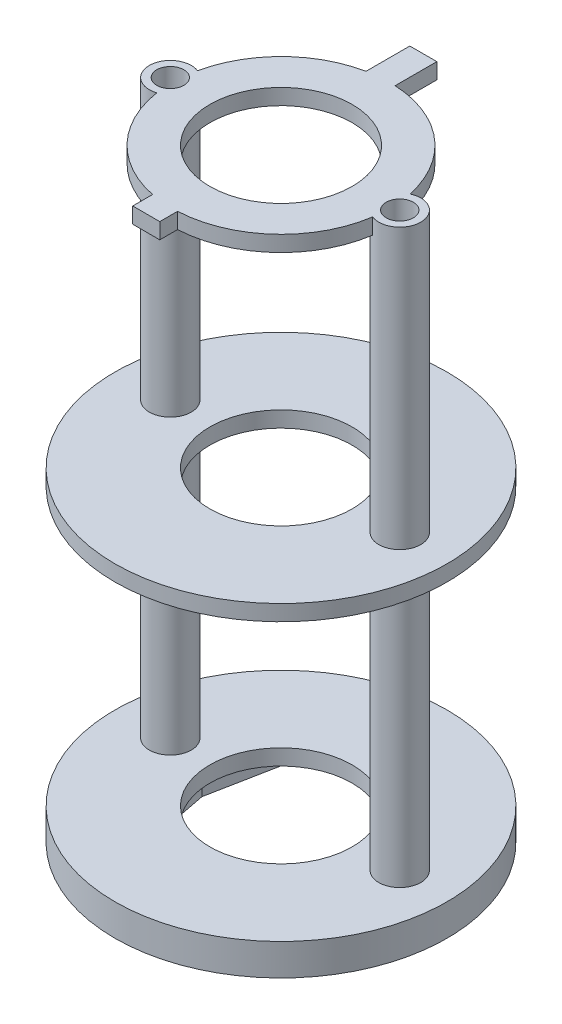
ISO-10303-21;
HEADER;
FILE_DESCRIPTION(('STEP AP214'),'2;1');
FILE_NAME('part.step','',(''),(''),'','','');
FILE_SCHEMA(('AUTOMOTIVE_DESIGN { 1 0 10303 214 1 1 1 1 }'));
ENDSEC;
DATA;
#1=APPLICATION_CONTEXT('core data for automotive mechanical design processes');
#2=APPLICATION_PROTOCOL_DEFINITION('international standard','automotive_design',2000,#1);
#3=PRODUCT_CONTEXT('',#1,'mechanical');
#4=PRODUCT('Part','Part','',(#3));
#5=PRODUCT_RELATED_PRODUCT_CATEGORY('part','',(#4));
#6=PRODUCT_DEFINITION_FORMATION('','',#4);
#7=PRODUCT_DEFINITION_CONTEXT('part definition',#1,'design');
#8=PRODUCT_DEFINITION('design','',#6,#7);
#9=PRODUCT_DEFINITION_SHAPE('','',#8);
#10=(LENGTH_UNIT() NAMED_UNIT(*) SI_UNIT(.MILLI.,.METRE.));
#11=(NAMED_UNIT(*) PLANE_ANGLE_UNIT() SI_UNIT($,.RADIAN.));
#12=(NAMED_UNIT(*) SI_UNIT($,.STERADIAN.) SOLID_ANGLE_UNIT());
#13=UNCERTAINTY_MEASURE_WITH_UNIT(LENGTH_MEASURE(1.E-05),#10,'distance_accuracy_value','');
#14=(GEOMETRIC_REPRESENTATION_CONTEXT(3) GLOBAL_UNCERTAINTY_ASSIGNED_CONTEXT((#13)) GLOBAL_UNIT_ASSIGNED_CONTEXT((#10,
#11,#12)) REPRESENTATION_CONTEXT('',''));
#15=CARTESIAN_POINT('',(0.,0.,0.));
#16=DIRECTION('',(0.,0.,1.));
#17=DIRECTION('',(1.,0.,0.));
#18=AXIS2_PLACEMENT_3D('',#15,#16,#17);
#19=CARTESIAN_POINT('',(14.5796,-2.,-0.434340000000001));
#20=DIRECTION('',(0.,1.,0.));
#21=DIRECTION('',(0.,0.,1.));
#22=AXIS2_PLACEMENT_3D('',#19,#20,#21);
#23=CYLINDRICAL_SURFACE('',#22,2.6543);
#24=CARTESIAN_POINT('',(14.5796,-72.305,-0.434340000000001));
#25=DIRECTION('',(0.,-1.,0.));
#26=DIRECTION('',(0.,0.,-1.));
#27=AXIS2_PLACEMENT_3D('',#24,#25,#26);
#28=CIRCLE('',#27,2.6543);
#29=CARTESIAN_POINT('',(14.5796,-72.305,-3.08864));
#30=VERTEX_POINT('',#29);
#31=EDGE_CURVE('E286',#30,#30,#28,.F.);
#32=ORIENTED_EDGE('',*,*,#31,.T.);
#33=EDGE_LOOP('',(#32));
#34=FACE_BOUND('',#33,.T.);
#35=CARTESIAN_POINT('',(14.5796,-37.305,-0.434340000000001));
#36=DIRECTION('',(0.,1.,0.));
#37=DIRECTION('',(0.,0.,1.));
#38=AXIS2_PLACEMENT_3D('',#35,#36,#37);
#39=CIRCLE('',#38,2.6543);
#40=CARTESIAN_POINT('',(14.5796,-37.305,2.21996));
#41=VERTEX_POINT('',#40);
#42=EDGE_CURVE('E221',#41,#41,#39,.F.);
#43=ORIENTED_EDGE('',*,*,#42,.T.);
#44=EDGE_LOOP('',(#43));
#45=FACE_BOUND('',#44,.T.);
#46=ADVANCED_FACE('F33',(#34,#45),#23,.T.);
#47=CARTESIAN_POINT('',(-14.4272,-2.,-0.434340000000001));
#48=DIRECTION('',(0.,1.,0.));
#49=DIRECTION('',(0.,0.,1.));
#50=AXIS2_PLACEMENT_3D('',#47,#48,#49);
#51=CYLINDRICAL_SURFACE('',#50,2.6543);
#52=CARTESIAN_POINT('',(-14.4272,-72.305,-0.434340000000001));
#53=DIRECTION('',(0.,-1.,0.));
#54=DIRECTION('',(0.,0.,-1.));
#55=AXIS2_PLACEMENT_3D('',#52,#53,#54);
#56=CIRCLE('',#55,2.6543);
#57=CARTESIAN_POINT('',(-14.4272,-72.305,-3.08864));
#58=VERTEX_POINT('',#57);
#59=EDGE_CURVE('E283',#58,#58,#56,.F.);
#60=ORIENTED_EDGE('',*,*,#59,.T.);
#61=EDGE_LOOP('',(#60));
#62=FACE_BOUND('',#61,.T.);
#63=CARTESIAN_POINT('',(-14.4272,-37.305,-0.434340000000001));
#64=DIRECTION('',(0.,1.,0.));
#65=DIRECTION('',(0.,0.,1.));
#66=AXIS2_PLACEMENT_3D('',#63,#64,#65);
#67=CIRCLE('',#66,2.6543);
#68=CARTESIAN_POINT('',(-14.4272,-37.305,2.21996));
#69=VERTEX_POINT('',#68);
#70=EDGE_CURVE('E634',#69,#69,#67,.F.);
#71=ORIENTED_EDGE('',*,*,#70,.T.);
#72=EDGE_LOOP('',(#71));
#73=FACE_BOUND('',#72,.T.);
#74=ADVANCED_FACE('F397',(#62,#73),#51,.T.);
#75=CARTESIAN_POINT('',(0.,-72.305,0.));
#76=DIRECTION('',(0.,-1.,0.));
#77=DIRECTION('',(0.,0.,-1.));
#78=AXIS2_PLACEMENT_3D('',#75,#76,#77);
#79=CYLINDRICAL_SURFACE('',#78,8.99);
#80=CARTESIAN_POINT('',(0.,-72.305,0.));
#81=DIRECTION('',(0.,-1.,0.));
#82=DIRECTION('',(0.,0.,-1.));
#83=AXIS2_PLACEMENT_3D('',#80,#81,#82);
#84=CIRCLE('',#83,8.99);
#85=CARTESIAN_POINT('',(0.,-72.305,-8.99));
#86=VERTEX_POINT('',#85);
#87=EDGE_CURVE('E277',#86,#86,#84,.T.);
#88=ORIENTED_EDGE('',*,*,#87,.F.);
#89=EDGE_LOOP('',(#88));
#90=FACE_BOUND('',#89,.T.);
#91=CARTESIAN_POINT('',(0.,-74.305,0.));
#92=DIRECTION('',(0.,-1.,0.));
#93=DIRECTION('',(0.,0.,-1.));
#94=AXIS2_PLACEMENT_3D('',#91,#92,#93);
#95=CIRCLE('',#94,8.99);
#96=CARTESIAN_POINT('',(0.,-74.305,-8.99));
#97=VERTEX_POINT('',#96);
#98=EDGE_CURVE('E37',#97,#97,#95,.F.);
#99=ORIENTED_EDGE('',*,*,#98,.F.);
#100=EDGE_LOOP('',(#99));
#101=FACE_BOUND('',#100,.T.);
#102=ADVANCED_FACE('F404',(#90,#101),#79,.F.);
#103=CARTESIAN_POINT('',(0.,-72.305,0.));
#104=DIRECTION('',(0.,-1.,0.));
#105=DIRECTION('',(0.,0.,-1.));
#106=AXIS2_PLACEMENT_3D('',#103,#104,#105);
#107=CYLINDRICAL_SURFACE('',#106,21.);
#108=CARTESIAN_POINT('',(0.,-72.305,0.));
#109=DIRECTION('',(0.,-1.,0.));
#110=DIRECTION('',(0.,0.,-1.));
#111=AXIS2_PLACEMENT_3D('',#108,#109,#110);
#112=CIRCLE('',#111,21.);
#113=CARTESIAN_POINT('',(0.,-72.305,-21.));
#114=VERTEX_POINT('',#113);
#115=EDGE_CURVE('E280',#114,#114,#112,.T.);
#116=ORIENTED_EDGE('',*,*,#115,.T.);
#117=EDGE_LOOP('',(#116));
#118=FACE_BOUND('',#117,.T.);
#119=CARTESIAN_POINT('',(0.,-76.305,0.));
#120=DIRECTION('',(0.,-1.,0.));
#121=DIRECTION('',(0.,0.,-1.));
#122=AXIS2_PLACEMENT_3D('',#119,#120,#121);
#123=CIRCLE('',#122,21.);
#124=CARTESIAN_POINT('',(0.,-76.305,-21.));
#125=VERTEX_POINT('',#124);
#126=EDGE_CURVE('E274',#125,#125,#123,.T.);
#127=ORIENTED_EDGE('',*,*,#126,.F.);
#128=EDGE_LOOP('',(#127));
#129=FACE_BOUND('',#128,.T.);
#130=ADVANCED_FACE('F463',(#118,#129),#107,.T.);
#131=CARTESIAN_POINT('',(0.,-72.305,0.));
#132=DIRECTION('',(0.,-1.,0.));
#133=DIRECTION('',(0.,0.,-1.));
#134=AXIS2_PLACEMENT_3D('',#131,#132,#133);
#135=PLANE('',#134);
#136=ORIENTED_EDGE('',*,*,#31,.F.);
#137=EDGE_LOOP('',(#136));
#138=FACE_BOUND('',#137,.T.);
#139=ORIENTED_EDGE('',*,*,#59,.F.);
#140=EDGE_LOOP('',(#139));
#141=FACE_BOUND('',#140,.T.);
#142=ORIENTED_EDGE('',*,*,#87,.T.);
#143=EDGE_LOOP('',(#142));
#144=FACE_BOUND('',#143,.T.);
#145=ORIENTED_EDGE('',*,*,#115,.F.);
#146=EDGE_LOOP('',(#145));
#147=FACE_BOUND('',#146,.T.);
#148=ADVANCED_FACE('F466',(#138,#141,#144,#147),#135,.F.);
#149=CARTESIAN_POINT('',(0.,-76.305,0.));
#150=DIRECTION('',(0.,-1.,0.));
#151=DIRECTION('',(0.,0.,-1.));
#152=AXIS2_PLACEMENT_3D('',#149,#150,#151);
#153=PLANE('',#152);
#154=DIRECTION('',(-0.190580912141045,0.,-0.981671490839724));
#155=VECTOR('',#154,1.);
#156=CARTESIAN_POINT('',(-7.35,-76.305,13.65));
#157=LINE('',#156,#155);
#158=CARTESIAN_POINT('',(-7.35,-76.305,13.65));
#159=VERTEX_POINT('',#158);
#160=CARTESIAN_POINT('',(-10.,-76.305,0.));
#161=VERTEX_POINT('',#160);
#162=EDGE_CURVE('E50',#159,#161,#157,.T.);
#163=ORIENTED_EDGE('',*,*,#162,.F.);
#164=CARTESIAN_POINT('',(0.,-76.305,0.00348029716001202));
#165=DIRECTION('',(0.,1.,0.));
#166=DIRECTION('',(0.,0.,1.));
#167=AXIS2_PLACEMENT_3D('',#164,#165,#166);
#168=CIRCLE('',#167,15.5);
#169=CARTESIAN_POINT('',(7.35,-76.305,13.65));
#170=VERTEX_POINT('',#169);
#171=EDGE_CURVE('E228',#159,#170,#168,.T.);
#172=ORIENTED_EDGE('',*,*,#171,.T.);
#173=DIRECTION('',(-0.190580912141045,0.,0.981671490839724));
#174=VECTOR('',#173,1.);
#175=CARTESIAN_POINT('',(10.,-76.305,0.));
#176=LINE('',#175,#174);
#177=CARTESIAN_POINT('',(10.,-76.305,0.));
#178=VERTEX_POINT('',#177);
#179=EDGE_CURVE('E254',#178,#170,#176,.T.);
#180=ORIENTED_EDGE('',*,*,#179,.F.);
#181=DIRECTION('',(0.190580912141045,0.,0.981671490839724));
#182=VECTOR('',#181,1.);
#183=CARTESIAN_POINT('',(7.35,-76.305,-13.65));
#184=LINE('',#183,#182);
#185=CARTESIAN_POINT('',(7.35,-76.305,-13.65));
#186=VERTEX_POINT('',#185);
#187=EDGE_CURVE('E251',#186,#178,#184,.T.);
#188=ORIENTED_EDGE('',*,*,#187,.F.);
#189=CARTESIAN_POINT('',(0.,-76.305,-0.00348029716001029));
#190=DIRECTION('',(0.,-1.,0.));
#191=DIRECTION('',(0.,0.,-1.));
#192=AXIS2_PLACEMENT_3D('',#189,#190,#191);
#193=CIRCLE('',#192,15.5);
#194=CARTESIAN_POINT('',(-7.35,-76.305,-13.65));
#195=VERTEX_POINT('',#194);
#196=EDGE_CURVE('E248',#195,#186,#193,.T.);
#197=ORIENTED_EDGE('',*,*,#196,.F.);
#198=DIRECTION('',(0.190580912141045,0.,-0.981671490839724));
#199=VECTOR('',#198,1.);
#200=CARTESIAN_POINT('',(-10.,-76.305,0.));
#201=LINE('',#200,#199);
#202=EDGE_CURVE('E245',#161,#195,#201,.T.);
#203=ORIENTED_EDGE('',*,*,#202,.F.);
#204=EDGE_LOOP('',(#163,#172,#180,#188,#197,#203));
#205=FACE_BOUND('',#204,.T.);
#206=ORIENTED_EDGE('',*,*,#126,.T.);
#207=EDGE_LOOP('',(#206));
#208=FACE_BOUND('',#207,.T.);
#209=ADVANCED_FACE('F380',(#205,#208),#153,.T.);
#210=CARTESIAN_POINT('',(0.,-74.305,-0.00348029716001029));
#211=DIRECTION('',(0.,-1.,0.));
#212=DIRECTION('',(0.,0.,-1.));
#213=AXIS2_PLACEMENT_3D('',#210,#211,#212);
#214=PLANE('',#213);
#215=DIRECTION('',(-0.190580912141045,0.,-0.981671490839724));
#216=VECTOR('',#215,1.);
#217=CARTESIAN_POINT('',(-7.35,-74.305,13.65));
#218=LINE('',#217,#216);
#219=CARTESIAN_POINT('',(-7.35,-74.305,13.65));
#220=VERTEX_POINT('',#219);
#221=CARTESIAN_POINT('',(-10.,-74.305,0.));
#222=VERTEX_POINT('',#221);
#223=EDGE_CURVE('E224',#220,#222,#218,.T.);
#224=ORIENTED_EDGE('',*,*,#223,.T.);
#225=DIRECTION('',(0.190580912141045,0.,-0.981671490839724));
#226=VECTOR('',#225,1.);
#227=CARTESIAN_POINT('',(-10.,-74.305,0.));
#228=LINE('',#227,#226);
#229=CARTESIAN_POINT('',(-7.35,-74.305,-13.65));
#230=VERTEX_POINT('',#229);
#231=EDGE_CURVE('E227',#222,#230,#228,.T.);
#232=ORIENTED_EDGE('',*,*,#231,.T.);
#233=CARTESIAN_POINT('',(0.,-74.305,-0.00348029716001029));
#234=DIRECTION('',(0.,-1.,0.));
#235=DIRECTION('',(0.,0.,-1.));
#236=AXIS2_PLACEMENT_3D('',#233,#234,#235);
#237=CIRCLE('',#236,15.5);
#238=CARTESIAN_POINT('',(7.35,-74.305,-13.65));
#239=VERTEX_POINT('',#238);
#240=EDGE_CURVE('E231',#230,#239,#237,.T.);
#241=ORIENTED_EDGE('',*,*,#240,.T.);
#242=DIRECTION('',(0.190580912141045,0.,0.981671490839724));
#243=VECTOR('',#242,1.);
#244=CARTESIAN_POINT('',(7.35,-74.305,-13.65));
#245=LINE('',#244,#243);
#246=CARTESIAN_POINT('',(10.,-74.305,0.));
#247=VERTEX_POINT('',#246);
#248=EDGE_CURVE('E234',#239,#247,#245,.T.);
#249=ORIENTED_EDGE('',*,*,#248,.T.);
#250=DIRECTION('',(-0.190580912141045,0.,0.981671490839724));
#251=VECTOR('',#250,1.);
#252=CARTESIAN_POINT('',(10.,-74.305,0.));
#253=LINE('',#252,#251);
#254=CARTESIAN_POINT('',(7.35,-74.305,13.65));
#255=VERTEX_POINT('',#254);
#256=EDGE_CURVE('E237',#247,#255,#253,.T.);
#257=ORIENTED_EDGE('',*,*,#256,.T.);
#258=CARTESIAN_POINT('',(0.,-74.305,0.00348029716001202));
#259=DIRECTION('',(0.,1.,0.));
#260=DIRECTION('',(0.,0.,1.));
#261=AXIS2_PLACEMENT_3D('',#258,#259,#260);
#262=CIRCLE('',#261,15.5);
#263=EDGE_CURVE('E240',#220,#255,#262,.T.);
#264=ORIENTED_EDGE('',*,*,#263,.F.);
#265=EDGE_LOOP('',(#224,#232,#241,#249,#257,#264));
#266=FACE_BOUND('',#265,.T.);
#267=ORIENTED_EDGE('',*,*,#98,.T.);
#268=EDGE_LOOP('',(#267));
#269=FACE_BOUND('',#268,.T.);
#270=ADVANCED_FACE('F368',(#266,#269),#214,.T.);
#271=CARTESIAN_POINT('',(-7.35,-74.305,13.65));
#272=DIRECTION('',(-0.981671490839724,0.,0.190580912141046));
#273=DIRECTION('',(0.190580912141046,0.,0.981671490839724));
#274=AXIS2_PLACEMENT_3D('',#271,#272,#273);
#275=PLANE('',#274);
#276=ORIENTED_EDGE('',*,*,#162,.T.);
#277=DIRECTION('',(0.,-1.,0.));
#278=VECTOR('',#277,1.);
#279=CARTESIAN_POINT('',(-10.,-74.305,0.));
#280=LINE('',#279,#278);
#281=EDGE_CURVE('E243',#222,#161,#280,.T.);
#282=ORIENTED_EDGE('',*,*,#281,.F.);
#283=ORIENTED_EDGE('',*,*,#223,.F.);
#284=DIRECTION('',(0.,-1.,0.));
#285=VECTOR('',#284,1.);
#286=CARTESIAN_POINT('',(-7.35,-74.305,13.65));
#287=LINE('',#286,#285);
#288=EDGE_CURVE('E259',#220,#159,#287,.T.);
#289=ORIENTED_EDGE('',*,*,#288,.T.);
#290=EDGE_LOOP('',(#276,#282,#283,#289));
#291=FACE_BOUND('',#290,.T.);
#292=ADVANCED_FACE('F361',(#291),#275,.F.);
#293=CARTESIAN_POINT('',(0.,-74.305,0.00348029716001202));
#294=DIRECTION('',(0.,-1.,0.));
#295=DIRECTION('',(0.,0.,-1.));
#296=AXIS2_PLACEMENT_3D('',#293,#294,#295);
#297=CYLINDRICAL_SURFACE('',#296,15.5);
#298=ORIENTED_EDGE('',*,*,#171,.F.);
#299=ORIENTED_EDGE('',*,*,#288,.F.);
#300=ORIENTED_EDGE('',*,*,#263,.T.);
#301=DIRECTION('',(0.,-1.,0.));
#302=VECTOR('',#301,1.);
#303=CARTESIAN_POINT('',(7.35,-74.305,13.65));
#304=LINE('',#303,#302);
#305=EDGE_CURVE('E261',#255,#170,#304,.T.);
#306=ORIENTED_EDGE('',*,*,#305,.T.);
#307=EDGE_LOOP('',(#298,#299,#300,#306));
#308=FACE_BOUND('',#307,.T.);
#309=ADVANCED_FACE('F374',(#308),#297,.F.);
#310=CARTESIAN_POINT('',(10.,-74.305,0.));
#311=DIRECTION('',(0.981671490839724,0.,0.190580912141045));
#312=DIRECTION('',(0.190580912141045,0.,-0.981671490839724));
#313=AXIS2_PLACEMENT_3D('',#310,#311,#312);
#314=PLANE('',#313);
#315=ORIENTED_EDGE('',*,*,#179,.T.);
#316=ORIENTED_EDGE('',*,*,#305,.F.);
#317=ORIENTED_EDGE('',*,*,#256,.F.);
#318=DIRECTION('',(0.,-1.,0.));
#319=VECTOR('',#318,1.);
#320=CARTESIAN_POINT('',(10.,-74.305,0.));
#321=LINE('',#320,#319);
#322=EDGE_CURVE('E264',#247,#178,#321,.T.);
#323=ORIENTED_EDGE('',*,*,#322,.T.);
#324=EDGE_LOOP('',(#315,#316,#317,#323));
#325=FACE_BOUND('',#324,.T.);
#326=ADVANCED_FACE('F376',(#325),#314,.F.);
#327=CARTESIAN_POINT('',(7.35,-74.305,-13.65));
#328=DIRECTION('',(0.981671490839724,0.,-0.190580912141045));
#329=DIRECTION('',(-0.190580912141045,0.,-0.981671490839724));
#330=AXIS2_PLACEMENT_3D('',#327,#328,#329);
#331=PLANE('',#330);
#332=ORIENTED_EDGE('',*,*,#187,.T.);
#333=ORIENTED_EDGE('',*,*,#322,.F.);
#334=ORIENTED_EDGE('',*,*,#248,.F.);
#335=DIRECTION('',(0.,-1.,0.));
#336=VECTOR('',#335,1.);
#337=CARTESIAN_POINT('',(7.35,-74.305,-13.65));
#338=LINE('',#337,#336);
#339=EDGE_CURVE('E267',#239,#186,#338,.T.);
#340=ORIENTED_EDGE('',*,*,#339,.T.);
#341=EDGE_LOOP('',(#332,#333,#334,#340));
#342=FACE_BOUND('',#341,.T.);
#343=ADVANCED_FACE('F387',(#342),#331,.F.);
#344=CARTESIAN_POINT('',(0.,-74.305,-0.00348029716001029));
#345=DIRECTION('',(0.,-1.,0.));
#346=DIRECTION('',(0.,0.,-1.));
#347=AXIS2_PLACEMENT_3D('',#344,#345,#346);
#348=CYLINDRICAL_SURFACE('',#347,15.5);
#349=ORIENTED_EDGE('',*,*,#196,.T.);
#350=ORIENTED_EDGE('',*,*,#339,.F.);
#351=ORIENTED_EDGE('',*,*,#240,.F.);
#352=DIRECTION('',(0.,-1.,0.));
#353=VECTOR('',#352,1.);
#354=CARTESIAN_POINT('',(-7.35,-74.305,-13.65));
#355=LINE('',#354,#353);
#356=EDGE_CURVE('E270',#230,#195,#355,.T.);
#357=ORIENTED_EDGE('',*,*,#356,.T.);
#358=EDGE_LOOP('',(#349,#350,#351,#357));
#359=FACE_BOUND('',#358,.T.);
#360=ADVANCED_FACE('F384',(#359),#348,.F.);
#361=CARTESIAN_POINT('',(-10.,-74.305,0.));
#362=DIRECTION('',(-0.981671490839724,0.,-0.190580912141045));
#363=DIRECTION('',(-0.190580912141045,0.,0.981671490839724));
#364=AXIS2_PLACEMENT_3D('',#361,#362,#363);
#365=PLANE('',#364);
#366=ORIENTED_EDGE('',*,*,#202,.T.);
#367=ORIENTED_EDGE('',*,*,#356,.F.);
#368=ORIENTED_EDGE('',*,*,#231,.F.);
#369=ORIENTED_EDGE('',*,*,#281,.T.);
#370=EDGE_LOOP('',(#366,#367,#368,#369));
#371=FACE_BOUND('',#370,.T.);
#372=ADVANCED_FACE('F364',(#371),#365,.F.);
#373=CARTESIAN_POINT('',(0.,-35.305,0.));
#374=DIRECTION('',(0.,1.,0.));
#375=DIRECTION('',(0.,0.,1.));
#376=AXIS2_PLACEMENT_3D('',#373,#374,#375);
#377=PLANE('',#376);
#378=CARTESIAN_POINT('',(14.5796,-35.305,-0.434340000000001));
#379=DIRECTION('',(0.,1.,0.));
#380=DIRECTION('',(0.,0.,1.));
#381=AXIS2_PLACEMENT_3D('',#378,#379,#380);
#382=CIRCLE('',#381,2.6543);
#383=CARTESIAN_POINT('',(14.5796,-35.305,2.21996));
#384=VERTEX_POINT('',#383);
#385=EDGE_CURVE('E11',#384,#384,#382,.F.);
#386=ORIENTED_EDGE('',*,*,#385,.T.);
#387=EDGE_LOOP('',(#386));
#388=FACE_BOUND('',#387,.T.);
#389=CARTESIAN_POINT('',(-14.4272,-35.305,-0.434340000000001));
#390=DIRECTION('',(0.,1.,0.));
#391=DIRECTION('',(0.,0.,1.));
#392=AXIS2_PLACEMENT_3D('',#389,#390,#391);
#393=CIRCLE('',#392,2.6543);
#394=CARTESIAN_POINT('',(-14.4272,-35.305,2.21996));
#395=VERTEX_POINT('',#394);
#396=EDGE_CURVE('E42',#395,#395,#393,.F.);
#397=ORIENTED_EDGE('',*,*,#396,.T.);
#398=EDGE_LOOP('',(#397));
#399=FACE_BOUND('',#398,.T.);
#400=CARTESIAN_POINT('',(0.,-35.305,0.));
#401=DIRECTION('',(0.,1.,0.));
#402=DIRECTION('',(0.,0.,1.));
#403=AXIS2_PLACEMENT_3D('',#400,#401,#402);
#404=CIRCLE('',#403,21.);
#405=CARTESIAN_POINT('',(0.,-35.305,21.));
#406=VERTEX_POINT('',#405);
#407=EDGE_CURVE('E631',#406,#406,#404,.T.);
#408=ORIENTED_EDGE('',*,*,#407,.T.);
#409=EDGE_LOOP('',(#408));
#410=FACE_BOUND('',#409,.T.);
#411=CARTESIAN_POINT('',(0.,-35.305,0.));
#412=DIRECTION('',(0.,1.,0.));
#413=DIRECTION('',(0.,0.,1.));
#414=AXIS2_PLACEMENT_3D('',#411,#412,#413);
#415=CIRCLE('',#414,8.99);
#416=CARTESIAN_POINT('',(0.,-35.305,8.99));
#417=VERTEX_POINT('',#416);
#418=EDGE_CURVE('E625',#417,#417,#415,.T.);
#419=ORIENTED_EDGE('',*,*,#418,.F.);
#420=EDGE_LOOP('',(#419));
#421=FACE_BOUND('',#420,.T.);
#422=ADVANCED_FACE('F479',(#388,#399,#410,#421),#377,.T.);
#423=CARTESIAN_POINT('',(0.,-37.305,0.));
#424=DIRECTION('',(0.,1.,0.));
#425=DIRECTION('',(0.,0.,1.));
#426=AXIS2_PLACEMENT_3D('',#423,#424,#425);
#427=PLANE('',#426);
#428=ORIENTED_EDGE('',*,*,#42,.F.);
#429=EDGE_LOOP('',(#428));
#430=FACE_BOUND('',#429,.T.);
#431=ORIENTED_EDGE('',*,*,#70,.F.);
#432=EDGE_LOOP('',(#431));
#433=FACE_BOUND('',#432,.T.);
#434=CARTESIAN_POINT('',(0.,-37.305,0.));
#435=DIRECTION('',(0.,1.,0.));
#436=DIRECTION('',(0.,0.,1.));
#437=AXIS2_PLACEMENT_3D('',#434,#435,#436);
#438=CIRCLE('',#437,21.);
#439=CARTESIAN_POINT('',(0.,-37.305,21.));
#440=VERTEX_POINT('',#439);
#441=EDGE_CURVE('E628',#440,#440,#438,.T.);
#442=ORIENTED_EDGE('',*,*,#441,.F.);
#443=EDGE_LOOP('',(#442));
#444=FACE_BOUND('',#443,.T.);
#445=CARTESIAN_POINT('',(0.,-37.305,0.));
#446=DIRECTION('',(0.,1.,0.));
#447=DIRECTION('',(0.,0.,1.));
#448=AXIS2_PLACEMENT_3D('',#445,#446,#447);
#449=CIRCLE('',#448,8.99);
#450=CARTESIAN_POINT('',(0.,-37.305,8.99));
#451=VERTEX_POINT('',#450);
#452=EDGE_CURVE('E622',#451,#451,#449,.T.);
#453=ORIENTED_EDGE('',*,*,#452,.T.);
#454=EDGE_LOOP('',(#453));
#455=FACE_BOUND('',#454,.T.);
#456=ADVANCED_FACE('F483',(#430,#433,#444,#455),#427,.F.);
#457=CARTESIAN_POINT('',(0.,-35.305,0.));
#458=DIRECTION('',(0.,-1.,0.));
#459=DIRECTION('',(0.,0.,-1.));
#460=AXIS2_PLACEMENT_3D('',#457,#458,#459);
#461=CYLINDRICAL_SURFACE('',#460,21.);
#462=ORIENTED_EDGE('',*,*,#407,.F.);
#463=EDGE_LOOP('',(#462));
#464=FACE_BOUND('',#463,.T.);
#465=ORIENTED_EDGE('',*,*,#441,.T.);
#466=EDGE_LOOP('',(#465));
#467=FACE_BOUND('',#466,.T.);
#468=ADVANCED_FACE('F489',(#464,#467),#461,.T.);
#469=CARTESIAN_POINT('',(0.,-35.305,0.));
#470=DIRECTION('',(0.,-1.,0.));
#471=DIRECTION('',(0.,0.,-1.));
#472=AXIS2_PLACEMENT_3D('',#469,#470,#471);
#473=CYLINDRICAL_SURFACE('',#472,8.99);
#474=ORIENTED_EDGE('',*,*,#418,.T.);
#475=EDGE_LOOP('',(#474));
#476=FACE_BOUND('',#475,.T.);
#477=ORIENTED_EDGE('',*,*,#452,.F.);
#478=EDGE_LOOP('',(#477));
#479=FACE_BOUND('',#478,.T.);
#480=ADVANCED_FACE('F493',(#476,#479),#473,.F.);
#481=CARTESIAN_POINT('',(-2.743211684,-2.,-19.02714));
#482=DIRECTION('',(0.,0.,1.));
#483=DIRECTION('',(1.,0.,0.));
#484=AXIS2_PLACEMENT_3D('',#481,#482,#483);
#485=PLANE('',#484);
#486=DIRECTION('',(1.,0.,0.));
#487=VECTOR('',#486,1.);
#488=CARTESIAN_POINT('',(-2.743211684,0.,-19.02714));
#489=LINE('',#488,#487);
#490=CARTESIAN_POINT('',(-2.743211684,0.,-19.02714));
#491=VERTEX_POINT('',#490);
#492=CARTESIAN_POINT('',(0.674160958000002,0.,-19.02714));
#493=VERTEX_POINT('',#492);
#494=EDGE_CURVE('E167',#491,#493,#489,.T.);
#495=ORIENTED_EDGE('',*,*,#494,.T.);
#496=DIRECTION('',(0.,1.,0.));
#497=VECTOR('',#496,1.);
#498=CARTESIAN_POINT('',(0.674160958000002,-2.,-19.02714));
#499=LINE('',#498,#497);
#500=CARTESIAN_POINT('',(0.674160958000002,-2.,-19.02714));
#501=VERTEX_POINT('',#500);
#502=EDGE_CURVE('E212',#501,#493,#499,.T.);
#503=ORIENTED_EDGE('',*,*,#502,.F.);
#504=DIRECTION('',(1.,0.,0.));
#505=VECTOR('',#504,1.);
#506=CARTESIAN_POINT('',(-2.743211684,-2.,-19.02714));
#507=LINE('',#506,#505);
#508=CARTESIAN_POINT('',(-2.743211684,-2.,-19.02714));
#509=VERTEX_POINT('',#508);
#510=EDGE_CURVE('E111',#509,#501,#507,.T.);
#511=ORIENTED_EDGE('',*,*,#510,.F.);
#512=DIRECTION('',(0.,1.,0.));
#513=VECTOR('',#512,1.);
#514=CARTESIAN_POINT('',(-2.743211684,-2.,-19.02714));
#515=LINE('',#514,#513);
#516=EDGE_CURVE('E214',#509,#491,#515,.T.);
#517=ORIENTED_EDGE('',*,*,#516,.T.);
#518=EDGE_LOOP('',(#495,#503,#511,#517));
#519=FACE_BOUND('',#518,.T.);
#520=ADVANCED_FACE('F562',(#519),#485,.F.);
#521=CARTESIAN_POINT('',(0.674160958000002,-2.,-19.02714));
#522=DIRECTION('',(-1.,0.,0.));
#523=DIRECTION('',(0.,0.,1.));
#524=AXIS2_PLACEMENT_3D('',#521,#522,#523);
#525=PLANE('',#524);
#526=DIRECTION('',(0.,0.,1.));
#527=VECTOR('',#526,1.);
#528=CARTESIAN_POINT('',(0.674160958000002,0.,-19.02714));
#529=LINE('',#528,#527);
#530=CARTESIAN_POINT('',(0.674160957999998,0.,-13.7502832422721));
#531=VERTEX_POINT('',#530);
#532=EDGE_CURVE('E170',#493,#531,#529,.T.);
#533=ORIENTED_EDGE('',*,*,#532,.T.);
#534=DIRECTION('',(0.,1.,0.));
#535=VECTOR('',#534,1.);
#536=CARTESIAN_POINT('',(0.674160957999998,-2.,-13.7502832422721));
#537=LINE('',#536,#535);
#538=CARTESIAN_POINT('',(0.674160957999998,-2.,-13.7502832422721));
#539=VERTEX_POINT('',#538);
#540=EDGE_CURVE('E210',#539,#531,#537,.T.);
#541=ORIENTED_EDGE('',*,*,#540,.F.);
#542=DIRECTION('',(0.,0.,1.));
#543=VECTOR('',#542,1.);
#544=CARTESIAN_POINT('',(0.674160958000002,-2.,-19.02714));
#545=LINE('',#544,#543);
#546=EDGE_CURVE('E306',#501,#539,#545,.T.);
#547=ORIENTED_EDGE('',*,*,#546,.F.);
#548=ORIENTED_EDGE('',*,*,#502,.T.);
#549=EDGE_LOOP('',(#533,#541,#547,#548));
#550=FACE_BOUND('',#549,.T.);
#551=ADVANCED_FACE('F441',(#550),#525,.F.);
#552=CARTESIAN_POINT('',(0.674160958000002,-2.,13.7502832422721));
#553=DIRECTION('',(-1.,0.,0.));
#554=DIRECTION('',(0.,0.,1.));
#555=AXIS2_PLACEMENT_3D('',#552,#553,#554);
#556=PLANE('',#555);
#557=DIRECTION('',(0.,0.,1.));
#558=VECTOR('',#557,1.);
#559=CARTESIAN_POINT('',(0.674160958000002,0.,13.7502832422721));
#560=LINE('',#559,#558);
#561=CARTESIAN_POINT('',(0.674160958000002,0.,13.7502832422721));
#562=VERTEX_POINT('',#561);
#563=CARTESIAN_POINT('',(0.674160958000002,0.,15.99946));
#564=VERTEX_POINT('',#563);
#565=EDGE_CURVE('E182',#562,#564,#560,.T.);
#566=ORIENTED_EDGE('',*,*,#565,.T.);
#567=DIRECTION('',(0.,1.,0.));
#568=VECTOR('',#567,1.);
#569=CARTESIAN_POINT('',(0.674160958000002,-2.,15.99946));
#570=LINE('',#569,#568);
#571=CARTESIAN_POINT('',(0.674160958000002,-2.,15.99946));
#572=VERTEX_POINT('',#571);
#573=EDGE_CURVE('E201',#572,#564,#570,.T.);
#574=ORIENTED_EDGE('',*,*,#573,.F.);
#575=DIRECTION('',(0.,0.,1.));
#576=VECTOR('',#575,1.);
#577=CARTESIAN_POINT('',(0.674160958000002,-2.,13.7502832422721));
#578=LINE('',#577,#576);
#579=CARTESIAN_POINT('',(0.674160958000002,-2.,13.7502832422721));
#580=VERTEX_POINT('',#579);
#581=EDGE_CURVE('E314',#580,#572,#578,.T.);
#582=ORIENTED_EDGE('',*,*,#581,.F.);
#583=DIRECTION('',(0.,1.,0.));
#584=VECTOR('',#583,1.);
#585=CARTESIAN_POINT('',(0.674160958000002,-2.,13.7502832422721));
#586=LINE('',#585,#584);
#587=EDGE_CURVE('E204',#580,#562,#586,.T.);
#588=ORIENTED_EDGE('',*,*,#587,.T.);
#589=EDGE_LOOP('',(#566,#574,#582,#588));
#590=FACE_BOUND('',#589,.T.);
#591=ADVANCED_FACE('F320',(#590),#556,.F.);
#592=CARTESIAN_POINT('',(0.674160958000002,-2.,15.99946));
#593=DIRECTION('',(0.,0.,-1.));
#594=DIRECTION('',(-1.,0.,0.));
#595=AXIS2_PLACEMENT_3D('',#592,#593,#594);
#596=PLANE('',#595);
#597=DIRECTION('',(-1.,0.,0.));
#598=VECTOR('',#597,1.);
#599=CARTESIAN_POINT('',(0.674160958000002,0.,15.99946));
#600=LINE('',#599,#598);
#601=CARTESIAN_POINT('',(-2.743211684,0.,15.99946));
#602=VERTEX_POINT('',#601);
#603=EDGE_CURVE('E184',#564,#602,#600,.T.);
#604=ORIENTED_EDGE('',*,*,#603,.T.);
#605=DIRECTION('',(0.,1.,0.));
#606=VECTOR('',#605,1.);
#607=CARTESIAN_POINT('',(-2.743211684,-2.,15.99946));
#608=LINE('',#607,#606);
#609=CARTESIAN_POINT('',(-2.743211684,-2.,15.99946));
#610=VERTEX_POINT('',#609);
#611=EDGE_CURVE('E155',#610,#602,#608,.T.);
#612=ORIENTED_EDGE('',*,*,#611,.F.);
#613=DIRECTION('',(-1.,0.,0.));
#614=VECTOR('',#613,1.);
#615=CARTESIAN_POINT('',(0.674160958000002,-2.,15.99946));
#616=LINE('',#615,#614);
#617=EDGE_CURVE('E142',#572,#610,#616,.T.);
#618=ORIENTED_EDGE('',*,*,#617,.F.);
#619=ORIENTED_EDGE('',*,*,#573,.T.);
#620=EDGE_LOOP('',(#604,#612,#618,#619));
#621=FACE_BOUND('',#620,.T.);
#622=ADVANCED_FACE('F324',(#621),#596,.F.);
#623=CARTESIAN_POINT('',(-2.743211684,-2.,15.99946));
#624=DIRECTION('',(1.,0.,0.));
#625=DIRECTION('',(0.,0.,-1.));
#626=AXIS2_PLACEMENT_3D('',#623,#624,#625);
#627=PLANE('',#626);
#628=DIRECTION('',(0.,0.,-1.));
#629=VECTOR('',#628,1.);
#630=CARTESIAN_POINT('',(-2.743211684,0.,15.99946));
#631=LINE('',#630,#629);
#632=CARTESIAN_POINT('',(-2.74321168400001,0.,13.4907216966612));
#633=VERTEX_POINT('',#632);
#634=EDGE_CURVE('E151',#602,#633,#631,.T.);
#635=ORIENTED_EDGE('',*,*,#634,.T.);
#636=DIRECTION('',(0.,1.,0.));
#637=VECTOR('',#636,1.);
#638=CARTESIAN_POINT('',(-2.74321168400001,-2.,13.4907216966612));
#639=LINE('',#638,#637);
#640=CARTESIAN_POINT('',(-2.74321168400001,-2.,13.4907216966612));
#641=VERTEX_POINT('',#640);
#642=EDGE_CURVE('E148',#641,#633,#639,.T.);
#643=ORIENTED_EDGE('',*,*,#642,.F.);
#644=DIRECTION('',(0.,0.,-1.));
#645=VECTOR('',#644,1.);
#646=CARTESIAN_POINT('',(-2.743211684,-2.,15.99946));
#647=LINE('',#646,#645);
#648=EDGE_CURVE('E135',#610,#641,#647,.T.);
#649=ORIENTED_EDGE('',*,*,#648,.F.);
#650=ORIENTED_EDGE('',*,*,#611,.T.);
#651=EDGE_LOOP('',(#635,#643,#649,#650));
#652=FACE_BOUND('',#651,.T.);
#653=ADVANCED_FACE('F149',(#652),#627,.F.);
#654=CARTESIAN_POINT('',(-2.743211684,-2.,-13.4907216966612));
#655=DIRECTION('',(1.,0.,0.));
#656=DIRECTION('',(0.,0.,-1.));
#657=AXIS2_PLACEMENT_3D('',#654,#655,#656);
#658=PLANE('',#657);
#659=DIRECTION('',(0.,0.,-1.));
#660=VECTOR('',#659,1.);
#661=CARTESIAN_POINT('',(-2.743211684,0.,-13.4907216966612));
#662=LINE('',#661,#660);
#663=CARTESIAN_POINT('',(-2.743211684,0.,-13.4907216966612));
#664=VERTEX_POINT('',#663);
#665=EDGE_CURVE('E165',#664,#491,#662,.T.);
#666=ORIENTED_EDGE('',*,*,#665,.T.);
#667=ORIENTED_EDGE('',*,*,#516,.F.);
#668=DIRECTION('',(0.,0.,-1.));
#669=VECTOR('',#668,1.);
#670=CARTESIAN_POINT('',(-2.743211684,-2.,-13.4907216966612));
#671=LINE('',#670,#669);
#672=CARTESIAN_POINT('',(-2.743211684,-2.,-13.4907216966612));
#673=VERTEX_POINT('',#672);
#674=EDGE_CURVE('E195',#673,#509,#671,.T.);
#675=ORIENTED_EDGE('',*,*,#674,.F.);
#676=DIRECTION('',(0.,1.,0.));
#677=VECTOR('',#676,1.);
#678=CARTESIAN_POINT('',(-2.743211684,-2.,-13.4907216966612));
#679=LINE('',#678,#677);
#680=EDGE_CURVE('E59',#673,#664,#679,.T.);
#681=ORIENTED_EDGE('',*,*,#680,.T.);
#682=EDGE_LOOP('',(#666,#667,#675,#681));
#683=FACE_BOUND('',#682,.T.);
#684=ADVANCED_FACE('F35',(#683),#658,.F.);
#685=CARTESIAN_POINT('',(0.,0.00100000000000013,0.));
#686=DIRECTION('',(0.,-1.,0.));
#687=DIRECTION('',(0.,0.,-1.));
#688=AXIS2_PLACEMENT_3D('',#685,#686,#687);
#689=CYLINDRICAL_SURFACE('',#688,8.99);
#690=CARTESIAN_POINT('',(0.,0.,0.));
#691=DIRECTION('',(0.,1.,0.));
#692=DIRECTION('',(0.,0.,1.));
#693=AXIS2_PLACEMENT_3D('',#690,#691,#692);
#694=CIRCLE('',#693,8.99);
#695=CARTESIAN_POINT('',(0.,0.,8.99));
#696=VERTEX_POINT('',#695);
#697=EDGE_CURVE('E289',#696,#696,#694,.F.);
#698=ORIENTED_EDGE('',*,*,#697,.F.);
#699=EDGE_LOOP('',(#698));
#700=FACE_BOUND('',#699,.T.);
#701=CARTESIAN_POINT('',(0.,-2.,0.));
#702=DIRECTION('',(0.,-1.,0.));
#703=DIRECTION('',(0.,0.,-1.));
#704=AXIS2_PLACEMENT_3D('',#701,#702,#703);
#705=CIRCLE('',#704,8.99);
#706=CARTESIAN_POINT('',(0.,-2.,-8.99));
#707=VERTEX_POINT('',#706);
#708=EDGE_CURVE('E290',#707,#707,#705,.T.);
#709=ORIENTED_EDGE('',*,*,#708,.T.);
#710=EDGE_LOOP('',(#709));
#711=FACE_BOUND('',#710,.T.);
#712=ADVANCED_FACE('F436',(#700,#711),#689,.F.);
#713=CARTESIAN_POINT('',(0.,-2.,0.));
#714=DIRECTION('',(0.,1.,0.));
#715=DIRECTION('',(0.,0.,1.));
#716=AXIS2_PLACEMENT_3D('',#713,#714,#715);
#717=CYLINDRICAL_SURFACE('',#716,13.7668);
#718=CARTESIAN_POINT('',(0.,0.,0.));
#719=DIRECTION('',(0.,1.,0.));
#720=DIRECTION('',(0.,0.,1.));
#721=AXIS2_PLACEMENT_3D('',#718,#719,#720);
#722=CIRCLE('',#721,13.7668);
#723=CARTESIAN_POINT('',(13.4695444870035,0.,-2.84537406198795));
#724=VERTEX_POINT('',#723);
#725=EDGE_CURVE('E173',#724,#531,#722,.T.);
#726=ORIENTED_EDGE('',*,*,#725,.F.);
#727=DIRECTION('',(0.,1.,0.));
#728=VECTOR('',#727,1.);
#729=CARTESIAN_POINT('',(13.4695444870035,-2.,-2.84537406198795));
#730=LINE('',#729,#728);
#731=CARTESIAN_POINT('',(13.4695444870035,-2.,-2.84537406198795));
#732=VERTEX_POINT('',#731);
#733=EDGE_CURVE('E208',#732,#724,#730,.T.);
#734=ORIENTED_EDGE('',*,*,#733,.F.);
#735=CARTESIAN_POINT('',(0.,-2.,0.));
#736=DIRECTION('',(0.,1.,0.));
#737=DIRECTION('',(0.,0.,1.));
#738=AXIS2_PLACEMENT_3D('',#735,#736,#737);
#739=CIRCLE('',#738,13.7668);
#740=EDGE_CURVE('E308',#732,#539,#739,.T.);
#741=ORIENTED_EDGE('',*,*,#740,.T.);
#742=ORIENTED_EDGE('',*,*,#540,.T.);
#743=EDGE_LOOP('',(#726,#734,#741,#742));
#744=FACE_BOUND('',#743,.T.);
#745=ADVANCED_FACE('F430',(#744),#717,.T.);
#746=CARTESIAN_POINT('',(0.,-2.,0.));
#747=DIRECTION('',(0.,1.,0.));
#748=DIRECTION('',(0.,0.,1.));
#749=AXIS2_PLACEMENT_3D('',#746,#747,#748);
#750=CYLINDRICAL_SURFACE('',#749,13.7668);
#751=CARTESIAN_POINT('',(0.,0.,0.));
#752=DIRECTION('',(0.,1.,0.));
#753=DIRECTION('',(0.,0.,1.));
#754=AXIS2_PLACEMENT_3D('',#751,#752,#753);
#755=CIRCLE('',#754,13.7668);
#756=CARTESIAN_POINT('',(13.6150396547462,0.,2.03849882013443));
#757=VERTEX_POINT('',#756);
#758=EDGE_CURVE('E179',#562,#757,#755,.T.);
#759=ORIENTED_EDGE('',*,*,#758,.F.);
#760=ORIENTED_EDGE('',*,*,#587,.F.);
#761=CARTESIAN_POINT('',(0.,-2.,0.));
#762=DIRECTION('',(0.,1.,0.));
#763=DIRECTION('',(0.,0.,1.));
#764=AXIS2_PLACEMENT_3D('',#761,#762,#763);
#765=CIRCLE('',#764,13.7668);
#766=CARTESIAN_POINT('',(13.6150396547462,-2.,2.03849882013443));
#767=VERTEX_POINT('',#766);
#768=EDGE_CURVE('E311',#580,#767,#765,.T.);
#769=ORIENTED_EDGE('',*,*,#768,.T.);
#770=DIRECTION('',(0.,1.,0.));
#771=VECTOR('',#770,1.);
#772=CARTESIAN_POINT('',(13.6150396547462,-2.,2.03849882013443));
#773=LINE('',#772,#771);
#774=EDGE_CURVE('E206',#767,#757,#773,.T.);
#775=ORIENTED_EDGE('',*,*,#774,.T.);
#776=EDGE_LOOP('',(#759,#760,#769,#775));
#777=FACE_BOUND('',#776,.T.);
#778=ADVANCED_FACE('F428',(#777),#750,.T.);
#779=CARTESIAN_POINT('',(0.,-2.,0.));
#780=DIRECTION('',(0.,1.,0.));
#781=DIRECTION('',(0.,0.,1.));
#782=AXIS2_PLACEMENT_3D('',#779,#780,#781);
#783=CYLINDRICAL_SURFACE('',#782,13.7668);
#784=CARTESIAN_POINT('',(0.,0.,0.));
#785=DIRECTION('',(0.,1.,0.));
#786=DIRECTION('',(0.,0.,1.));
#787=AXIS2_PLACEMENT_3D('',#784,#785,#786);
#788=CIRCLE('',#787,13.7668);
#789=CARTESIAN_POINT('',(-13.6072098116879,0.,2.09012520694422));
#790=VERTEX_POINT('',#789);
#791=EDGE_CURVE('E187',#790,#633,#788,.T.);
#792=ORIENTED_EDGE('',*,*,#791,.F.);
#793=DIRECTION('',(0.,1.,0.));
#794=VECTOR('',#793,1.);
#795=CARTESIAN_POINT('',(-13.6072098116879,-2.,2.09012520694422));
#796=LINE('',#795,#794);
#797=CARTESIAN_POINT('',(-13.6072098116879,-2.,2.09012520694422));
#798=VERTEX_POINT('',#797);
#799=EDGE_CURVE('E156',#798,#790,#796,.T.);
#800=ORIENTED_EDGE('',*,*,#799,.F.);
#801=CARTESIAN_POINT('',(0.,-2.,0.));
#802=DIRECTION('',(0.,1.,0.));
#803=DIRECTION('',(0.,0.,1.));
#804=AXIS2_PLACEMENT_3D('',#801,#802,#803);
#805=CIRCLE('',#804,13.7668);
#806=EDGE_CURVE('E140',#798,#641,#805,.T.);
#807=ORIENTED_EDGE('',*,*,#806,.T.);
#808=ORIENTED_EDGE('',*,*,#642,.T.);
#809=EDGE_LOOP('',(#792,#800,#807,#808));
#810=FACE_BOUND('',#809,.T.);
#811=ADVANCED_FACE('F159',(#810),#783,.T.);
#812=CARTESIAN_POINT('',(0.,-2.,0.));
#813=DIRECTION('',(0.,1.,0.));
#814=DIRECTION('',(0.,0.,1.));
#815=AXIS2_PLACEMENT_3D('',#812,#813,#814);
#816=PLANE('',#815);
#817=ORIENTED_EDGE('',*,*,#708,.F.);
#818=EDGE_LOOP('',(#817));
#819=FACE_BOUND('',#818,.T.);
#820=CARTESIAN_POINT('',(-14.4272,-2.,-0.434340000000001));
#821=DIRECTION('',(0.,-1.,0.));
#822=DIRECTION('',(0.,0.,-1.));
#823=AXIS2_PLACEMENT_3D('',#820,#821,#822);
#824=CIRCLE('',#823,2.6543);
#825=CARTESIAN_POINT('',(-13.4568312519173,-2.,-2.90490531642952));
#826=VERTEX_POINT('',#825);
#827=EDGE_CURVE('E293',#826,#798,#824,.T.);
#828=ORIENTED_EDGE('',*,*,#827,.F.);
#829=CARTESIAN_POINT('',(0.,-2.,0.));
#830=DIRECTION('',(0.,1.,0.));
#831=DIRECTION('',(0.,0.,1.));
#832=AXIS2_PLACEMENT_3D('',#829,#830,#831);
#833=CIRCLE('',#832,13.7668);
#834=EDGE_CURVE('E160',#673,#826,#833,.T.);
#835=ORIENTED_EDGE('',*,*,#834,.F.);
#836=ORIENTED_EDGE('',*,*,#674,.T.);
#837=ORIENTED_EDGE('',*,*,#510,.T.);
#838=ORIENTED_EDGE('',*,*,#546,.T.);
#839=ORIENTED_EDGE('',*,*,#740,.F.);
#840=CARTESIAN_POINT('',(14.5796,-2.,-0.434340000000001));
#841=DIRECTION('',(0.,-1.,0.));
#842=DIRECTION('',(0.,0.,-1.));
#843=AXIS2_PLACEMENT_3D('',#840,#841,#842);
#844=CIRCLE('',#843,2.6543);
#845=EDGE_CURVE('E297',#767,#732,#844,.T.);
#846=ORIENTED_EDGE('',*,*,#845,.F.);
#847=ORIENTED_EDGE('',*,*,#768,.F.);
#848=ORIENTED_EDGE('',*,*,#581,.T.);
#849=ORIENTED_EDGE('',*,*,#617,.T.);
#850=ORIENTED_EDGE('',*,*,#648,.T.);
#851=ORIENTED_EDGE('',*,*,#806,.F.);
#852=EDGE_LOOP('',(#828,#835,#836,#837,#838,#839,#846,#847,#848,#849,#850,#851));
#853=FACE_BOUND('',#852,.T.);
#854=ADVANCED_FACE('F138',(#819,#853),#816,.F.);
#855=CARTESIAN_POINT('',(0.,-2.,0.));
#856=DIRECTION('',(0.,1.,0.));
#857=DIRECTION('',(0.,0.,1.));
#858=AXIS2_PLACEMENT_3D('',#855,#856,#857);
#859=CYLINDRICAL_SURFACE('',#858,13.7668);
#860=CARTESIAN_POINT('',(0.,0.,0.));
#861=DIRECTION('',(0.,1.,0.));
#862=DIRECTION('',(0.,0.,1.));
#863=AXIS2_PLACEMENT_3D('',#860,#861,#862);
#864=CIRCLE('',#863,13.7668);
#865=CARTESIAN_POINT('',(-13.4568312519173,0.,-2.90490531642952));
#866=VERTEX_POINT('',#865);
#867=EDGE_CURVE('E192',#664,#866,#864,.T.);
#868=ORIENTED_EDGE('',*,*,#867,.F.);
#869=ORIENTED_EDGE('',*,*,#680,.F.);
#870=ORIENTED_EDGE('',*,*,#834,.T.);
#871=DIRECTION('',(0.,1.,0.));
#872=VECTOR('',#871,1.);
#873=CARTESIAN_POINT('',(-13.4568312519173,-2.,-2.90490531642952));
#874=LINE('',#873,#872);
#875=EDGE_CURVE('E197',#826,#866,#874,.T.);
#876=ORIENTED_EDGE('',*,*,#875,.T.);
#877=EDGE_LOOP('',(#868,#869,#870,#876));
#878=FACE_BOUND('',#877,.T.);
#879=ADVANCED_FACE('F411',(#878),#859,.T.);
#880=ORIENTED_EDGE('',*,*,#385,.F.);
#881=EDGE_LOOP('',(#880));
#882=FACE_BOUND('',#881,.T.);
#883=CARTESIAN_POINT('',(14.5796,0.,-0.434340000000001));
#884=DIRECTION('',(0.,1.,0.));
#885=DIRECTION('',(0.,0.,1.));
#886=AXIS2_PLACEMENT_3D('',#883,#884,#885);
#887=CIRCLE('',#886,2.6543);
#888=EDGE_CURVE('E176',#757,#724,#887,.T.);
#889=ORIENTED_EDGE('',*,*,#888,.F.);
#890=ORIENTED_EDGE('',*,*,#774,.F.);
#891=ORIENTED_EDGE('',*,*,#845,.T.);
#892=ORIENTED_EDGE('',*,*,#733,.T.);
#893=EDGE_LOOP('',(#889,#890,#891,#892));
#894=FACE_BOUND('',#893,.T.);
#895=ADVANCED_FACE('F400',(#882,#894),#23,.T.);
#896=ORIENTED_EDGE('',*,*,#396,.F.);
#897=EDGE_LOOP('',(#896));
#898=FACE_BOUND('',#897,.T.);
#899=CARTESIAN_POINT('',(-14.4272,0.,-0.434340000000001));
#900=DIRECTION('',(0.,1.,0.));
#901=DIRECTION('',(0.,0.,1.));
#902=AXIS2_PLACEMENT_3D('',#899,#900,#901);
#903=CIRCLE('',#902,2.6543);
#904=EDGE_CURVE('E189',#866,#790,#903,.T.);
#905=ORIENTED_EDGE('',*,*,#904,.F.);
#906=ORIENTED_EDGE('',*,*,#875,.F.);
#907=ORIENTED_EDGE('',*,*,#827,.T.);
#908=ORIENTED_EDGE('',*,*,#799,.T.);
#909=EDGE_LOOP('',(#905,#906,#907,#908));
#910=FACE_BOUND('',#909,.T.);
#911=ADVANCED_FACE('F330',(#898,#910),#51,.T.);
#912=CARTESIAN_POINT('',(14.5796,-2.001,-0.434340000000001));
#913=DIRECTION('',(0.,1.,0.));
#914=DIRECTION('',(0.,0.,1.));
#915=AXIS2_PLACEMENT_3D('',#912,#913,#914);
#916=CYLINDRICAL_SURFACE('',#915,1.7145);
#917=CARTESIAN_POINT('',(14.5796,-15.,-0.434340000000001));
#918=DIRECTION('',(0.,1.,0.));
#919=DIRECTION('',(0.,0.,1.));
#920=AXIS2_PLACEMENT_3D('',#917,#918,#919);
#921=CIRCLE('',#920,1.7145);
#922=CARTESIAN_POINT('',(14.5796,-15.,1.28016));
#923=VERTEX_POINT('',#922);
#924=EDGE_CURVE('E618',#923,#923,#921,.T.);
#925=ORIENTED_EDGE('',*,*,#924,.F.);
#926=EDGE_LOOP('',(#925));
#927=FACE_BOUND('',#926,.T.);
#928=CARTESIAN_POINT('',(14.5796,0.,-0.434340000000001));
#929=DIRECTION('',(0.,1.,0.));
#930=DIRECTION('',(0.,0.,1.));
#931=AXIS2_PLACEMENT_3D('',#928,#929,#930);
#932=CIRCLE('',#931,1.7145);
#933=CARTESIAN_POINT('',(14.5796,0.,1.28016));
#934=VERTEX_POINT('',#933);
#935=EDGE_CURVE('E168',#934,#934,#932,.T.);
#936=ORIENTED_EDGE('',*,*,#935,.T.);
#937=EDGE_LOOP('',(#936));
#938=FACE_BOUND('',#937,.T.);
#939=ADVANCED_FACE('F417',(#927,#938),#916,.F.);
#940=CARTESIAN_POINT('',(0.,0.,0.));
#941=DIRECTION('',(0.,1.,0.));
#942=DIRECTION('',(0.,0.,1.));
#943=AXIS2_PLACEMENT_3D('',#940,#941,#942);
#944=PLANE('',#943);
#945=ORIENTED_EDGE('',*,*,#697,.T.);
#946=EDGE_LOOP('',(#945));
#947=FACE_BOUND('',#946,.T.);
#948=CARTESIAN_POINT('',(-14.4272,0.,-0.434340000000001));
#949=DIRECTION('',(0.,1.,0.));
#950=DIRECTION('',(0.,0.,1.));
#951=AXIS2_PLACEMENT_3D('',#948,#949,#950);
#952=CIRCLE('',#951,1.7145);
#953=CARTESIAN_POINT('',(-14.4272,0.,1.28016));
#954=VERTEX_POINT('',#953);
#955=EDGE_CURVE('E299',#954,#954,#952,.T.);
#956=ORIENTED_EDGE('',*,*,#955,.F.);
#957=EDGE_LOOP('',(#956));
#958=FACE_BOUND('',#957,.T.);
#959=ORIENTED_EDGE('',*,*,#935,.F.);
#960=EDGE_LOOP('',(#959));
#961=FACE_BOUND('',#960,.T.);
#962=ORIENTED_EDGE('',*,*,#665,.F.);
#963=ORIENTED_EDGE('',*,*,#867,.T.);
#964=ORIENTED_EDGE('',*,*,#904,.T.);
#965=ORIENTED_EDGE('',*,*,#791,.T.);
#966=ORIENTED_EDGE('',*,*,#634,.F.);
#967=ORIENTED_EDGE('',*,*,#603,.F.);
#968=ORIENTED_EDGE('',*,*,#565,.F.);
#969=ORIENTED_EDGE('',*,*,#758,.T.);
#970=ORIENTED_EDGE('',*,*,#888,.T.);
#971=ORIENTED_EDGE('',*,*,#725,.T.);
#972=ORIENTED_EDGE('',*,*,#532,.F.);
#973=ORIENTED_EDGE('',*,*,#494,.F.);
#974=EDGE_LOOP('',(#962,#963,#964,#965,#966,#967,#968,#969,#970,#971,#972,#973));
#975=FACE_BOUND('',#974,.T.);
#976=ADVANCED_FACE('F326',(#947,#958,#961,#975),#944,.T.);
#977=CARTESIAN_POINT('',(-14.4272,-2.001,-0.434340000000001));
#978=DIRECTION('',(0.,1.,0.));
#979=DIRECTION('',(0.,0.,1.));
#980=AXIS2_PLACEMENT_3D('',#977,#978,#979);
#981=CYLINDRICAL_SURFACE('',#980,1.7145);
#982=CARTESIAN_POINT('',(-14.4272,-15.,-0.434340000000001));
#983=DIRECTION('',(0.,1.,0.));
#984=DIRECTION('',(0.,0.,1.));
#985=AXIS2_PLACEMENT_3D('',#982,#983,#984);
#986=CIRCLE('',#985,1.7145);
#987=CARTESIAN_POINT('',(-14.4272,-15.,1.28016));
#988=VERTEX_POINT('',#987);
#989=EDGE_CURVE('E619',#988,#988,#986,.T.);
#990=ORIENTED_EDGE('',*,*,#989,.F.);
#991=EDGE_LOOP('',(#990));
#992=FACE_BOUND('',#991,.T.);
#993=ORIENTED_EDGE('',*,*,#955,.T.);
#994=EDGE_LOOP('',(#993));
#995=FACE_BOUND('',#994,.T.);
#996=ADVANCED_FACE('F448',(#992,#995),#981,.F.);
#997=CARTESIAN_POINT('',(0.,-15.,0.));
#998=DIRECTION('',(0.,1.,0.));
#999=DIRECTION('',(0.,0.,1.));
#1000=AXIS2_PLACEMENT_3D('',#997,#998,#999);
#1001=PLANE('',#1000);
#1002=ORIENTED_EDGE('',*,*,#989,.T.);
#1003=EDGE_LOOP('',(#1002));
#1004=FACE_BOUND('',#1003,.T.);
#1005=ADVANCED_FACE('F458',(#1004),#1001,.T.);
#1006=CARTESIAN_POINT('',(0.,-15.,0.));
#1007=DIRECTION('',(0.,1.,0.));
#1008=DIRECTION('',(0.,0.,1.));
#1009=AXIS2_PLACEMENT_3D('',#1006,#1007,#1008);
#1010=PLANE('',#1009);
#1011=ORIENTED_EDGE('',*,*,#924,.T.);
#1012=EDGE_LOOP('',(#1011));
#1013=FACE_BOUND('',#1012,.T.);
#1014=ADVANCED_FACE('F603',(#1013),#1010,.T.);
#1015=CLOSED_SHELL('',(#46,#74,#102,#130,#148,#209,#270,#292,#309,#326,#343,#360,#372,#422,#456,
#468,#480,#520,#551,#591,#622,#653,#684,#712,#745,#778,#811,#854,#879,#895,#911,#939,#976,#996,
#1005,#1014));
#1016=MANIFOLD_SOLID_BREP('B2',#1015);
#1017=ADVANCED_BREP_SHAPE_REPRESENTATION('',(#18,#1016),#14);
#1018=SHAPE_DEFINITION_REPRESENTATION(#9,#1017);
ENDSEC;
END-ISO-10303-21;
